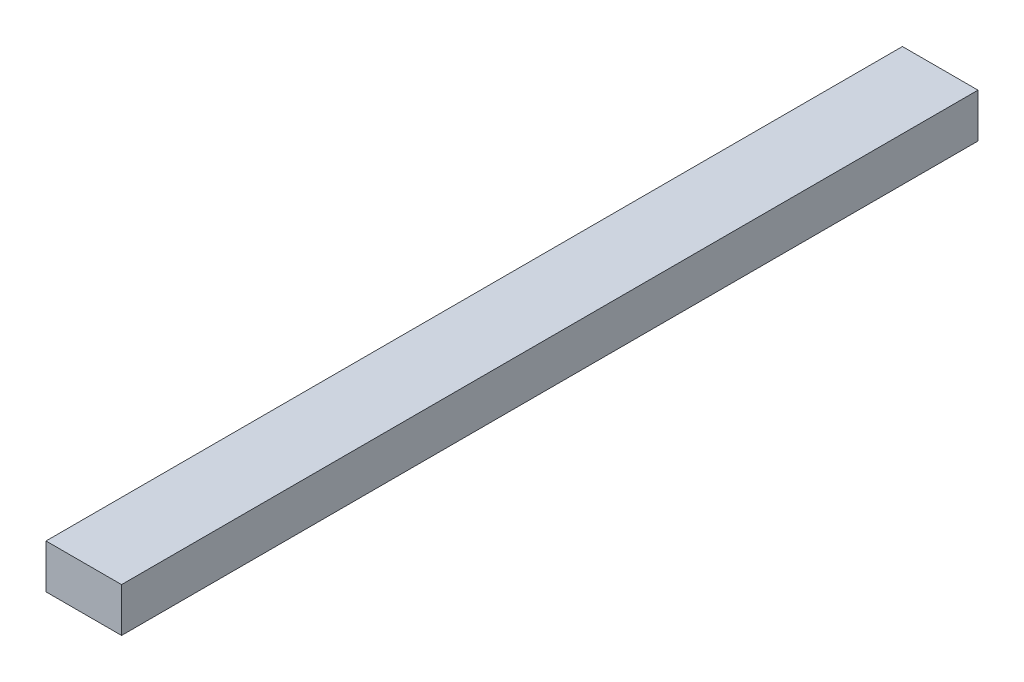
ISO-10303-21;
HEADER;
FILE_DESCRIPTION(('STEP AP214'),'2;1');
FILE_NAME('part.step','',(''),(''),'','','');
FILE_SCHEMA(('AUTOMOTIVE_DESIGN { 1 0 10303 214 1 1 1 1 }'));
ENDSEC;
DATA;
#1=APPLICATION_CONTEXT('core data for automotive mechanical design processes');
#2=APPLICATION_PROTOCOL_DEFINITION('international standard','automotive_design',2000,#1);
#3=PRODUCT_CONTEXT('',#1,'mechanical');
#4=PRODUCT('Part','Part','',(#3));
#5=PRODUCT_RELATED_PRODUCT_CATEGORY('part','',(#4));
#6=PRODUCT_DEFINITION_FORMATION('','',#4);
#7=PRODUCT_DEFINITION_CONTEXT('part definition',#1,'design');
#8=PRODUCT_DEFINITION('design','',#6,#7);
#9=PRODUCT_DEFINITION_SHAPE('','',#8);
#10=(LENGTH_UNIT() NAMED_UNIT(*) SI_UNIT(.MILLI.,.METRE.));
#11=(NAMED_UNIT(*) PLANE_ANGLE_UNIT() SI_UNIT($,.RADIAN.));
#12=(NAMED_UNIT(*) SI_UNIT($,.STERADIAN.) SOLID_ANGLE_UNIT());
#13=UNCERTAINTY_MEASURE_WITH_UNIT(LENGTH_MEASURE(1.E-05),#10,'distance_accuracy_value','');
#14=(GEOMETRIC_REPRESENTATION_CONTEXT(3) GLOBAL_UNCERTAINTY_ASSIGNED_CONTEXT((#13)) GLOBAL_UNIT_ASSIGNED_CONTEXT((#10,
#11,#12)) REPRESENTATION_CONTEXT('',''));
#15=CARTESIAN_POINT('',(0.,0.,0.));
#16=DIRECTION('',(0.,0.,1.));
#17=DIRECTION('',(1.,0.,0.));
#18=AXIS2_PLACEMENT_3D('',#15,#16,#17);
#19=CARTESIAN_POINT('',(0.,0.,431.8));
#20=DIRECTION('',(1.,0.,0.));
#21=DIRECTION('',(0.,0.,-1.));
#22=AXIS2_PLACEMENT_3D('',#19,#20,#21);
#23=PLANE('',#22);
#24=DIRECTION('',(0.,-1.,0.));
#25=VECTOR('',#24,1.);
#26=CARTESIAN_POINT('',(0.,0.,0.));
#27=LINE('',#26,#25);
#28=CARTESIAN_POINT('',(0.,22.225,0.));
#29=VERTEX_POINT('',#28);
#30=CARTESIAN_POINT('',(0.,0.,0.));
#31=VERTEX_POINT('',#30);
#32=EDGE_CURVE('E95',#29,#31,#27,.T.);
#33=ORIENTED_EDGE('',*,*,#32,.T.);
#34=DIRECTION('',(0.,0.,-1.));
#35=VECTOR('',#34,1.);
#36=CARTESIAN_POINT('',(0.,0.,431.8));
#37=LINE('',#36,#35);
#38=CARTESIAN_POINT('',(0.,0.,431.8));
#39=VERTEX_POINT('',#38);
#40=EDGE_CURVE('E11',#39,#31,#37,.T.);
#41=ORIENTED_EDGE('',*,*,#40,.F.);
#42=DIRECTION('',(0.,-1.,0.));
#43=VECTOR('',#42,1.);
#44=CARTESIAN_POINT('',(0.,0.,431.8));
#45=LINE('',#44,#43);
#46=CARTESIAN_POINT('',(0.,22.225,431.8));
#47=VERTEX_POINT('',#46);
#48=EDGE_CURVE('E83',#47,#39,#45,.T.);
#49=ORIENTED_EDGE('',*,*,#48,.F.);
#50=DIRECTION('',(0.,0.,-1.));
#51=VECTOR('',#50,1.);
#52=CARTESIAN_POINT('',(0.,22.225,431.8));
#53=LINE('',#52,#51);
#54=EDGE_CURVE('E91',#47,#29,#53,.T.);
#55=ORIENTED_EDGE('',*,*,#54,.T.);
#56=EDGE_LOOP('',(#33,#41,#49,#55));
#57=FACE_BOUND('',#56,.T.);
#58=ADVANCED_FACE('F32',(#57),#23,.F.);
#59=CARTESIAN_POINT('',(0.,0.,431.8));
#60=DIRECTION('',(0.,1.,0.));
#61=DIRECTION('',(0.,0.,1.));
#62=AXIS2_PLACEMENT_3D('',#59,#60,#61);
#63=PLANE('',#62);
#64=DIRECTION('',(1.,0.,0.));
#65=VECTOR('',#64,1.);
#66=CARTESIAN_POINT('',(0.,0.,0.));
#67=LINE('',#66,#65);
#68=CARTESIAN_POINT('',(38.1,0.,0.));
#69=VERTEX_POINT('',#68);
#70=EDGE_CURVE('E87',#31,#69,#67,.T.);
#71=ORIENTED_EDGE('',*,*,#70,.T.);
#72=DIRECTION('',(0.,0.,-1.));
#73=VECTOR('',#72,1.);
#74=CARTESIAN_POINT('',(38.1,0.,431.8));
#75=LINE('',#74,#73);
#76=CARTESIAN_POINT('',(38.1,0.,431.8));
#77=VERTEX_POINT('',#76);
#78=EDGE_CURVE('E40',#77,#69,#75,.T.);
#79=ORIENTED_EDGE('',*,*,#78,.F.);
#80=DIRECTION('',(1.,0.,0.));
#81=VECTOR('',#80,1.);
#82=CARTESIAN_POINT('',(0.,0.,431.8));
#83=LINE('',#82,#81);
#84=EDGE_CURVE('E78',#39,#77,#83,.T.);
#85=ORIENTED_EDGE('',*,*,#84,.F.);
#86=ORIENTED_EDGE('',*,*,#40,.T.);
#87=EDGE_LOOP('',(#71,#79,#85,#86));
#88=FACE_BOUND('',#87,.T.);
#89=ADVANCED_FACE('F86',(#88),#63,.F.);
#90=CARTESIAN_POINT('',(38.1,0.,431.8));
#91=DIRECTION('',(-1.,0.,0.));
#92=DIRECTION('',(0.,0.,1.));
#93=AXIS2_PLACEMENT_3D('',#90,#91,#92);
#94=PLANE('',#93);
#95=DIRECTION('',(0.,1.,0.));
#96=VECTOR('',#95,1.);
#97=CARTESIAN_POINT('',(38.1,0.,0.));
#98=LINE('',#97,#96);
#99=CARTESIAN_POINT('',(38.1,22.225,0.));
#100=VERTEX_POINT('',#99);
#101=EDGE_CURVE('E65',#69,#100,#98,.T.);
#102=ORIENTED_EDGE('',*,*,#101,.T.);
#103=DIRECTION('',(0.,0.,-1.));
#104=VECTOR('',#103,1.);
#105=CARTESIAN_POINT('',(38.1,22.225,431.8));
#106=LINE('',#105,#104);
#107=CARTESIAN_POINT('',(38.1,22.225,431.8));
#108=VERTEX_POINT('',#107);
#109=EDGE_CURVE('E88',#108,#100,#106,.T.);
#110=ORIENTED_EDGE('',*,*,#109,.F.);
#111=DIRECTION('',(0.,1.,0.));
#112=VECTOR('',#111,1.);
#113=CARTESIAN_POINT('',(38.1,0.,431.8));
#114=LINE('',#113,#112);
#115=EDGE_CURVE('E81',#77,#108,#114,.T.);
#116=ORIENTED_EDGE('',*,*,#115,.F.);
#117=ORIENTED_EDGE('',*,*,#78,.T.);
#118=EDGE_LOOP('',(#102,#110,#116,#117));
#119=FACE_BOUND('',#118,.T.);
#120=ADVANCED_FACE('F89',(#119),#94,.F.);
#121=CARTESIAN_POINT('',(0.,22.225,431.8));
#122=DIRECTION('',(0.,-1.,0.));
#123=DIRECTION('',(0.,0.,-1.));
#124=AXIS2_PLACEMENT_3D('',#121,#122,#123);
#125=PLANE('',#124);
#126=DIRECTION('',(-1.,0.,0.));
#127=VECTOR('',#126,1.);
#128=CARTESIAN_POINT('',(0.,22.225,0.));
#129=LINE('',#128,#127);
#130=EDGE_CURVE('E71',#100,#29,#129,.T.);
#131=ORIENTED_EDGE('',*,*,#130,.T.);
#132=ORIENTED_EDGE('',*,*,#54,.F.);
#133=DIRECTION('',(-1.,0.,0.));
#134=VECTOR('',#133,1.);
#135=CARTESIAN_POINT('',(0.,22.225,431.8));
#136=LINE('',#135,#134);
#137=EDGE_CURVE('E48',#108,#47,#136,.T.);
#138=ORIENTED_EDGE('',*,*,#137,.F.);
#139=ORIENTED_EDGE('',*,*,#109,.T.);
#140=EDGE_LOOP('',(#131,#132,#138,#139));
#141=FACE_BOUND('',#140,.T.);
#142=ADVANCED_FACE('F102',(#141),#125,.F.);
#143=CARTESIAN_POINT('',(0.,0.,431.8));
#144=DIRECTION('',(0.,0.,-1.));
#145=DIRECTION('',(-1.,0.,0.));
#146=AXIS2_PLACEMENT_3D('',#143,#144,#145);
#147=PLANE('',#146);
#148=ORIENTED_EDGE('',*,*,#48,.T.);
#149=ORIENTED_EDGE('',*,*,#84,.T.);
#150=ORIENTED_EDGE('',*,*,#115,.T.);
#151=ORIENTED_EDGE('',*,*,#137,.T.);
#152=EDGE_LOOP('',(#148,#149,#150,#151));
#153=FACE_BOUND('',#152,.T.);
#154=ADVANCED_FACE('F79',(#153),#147,.F.);
#155=CARTESIAN_POINT('',(0.,0.,0.));
#156=DIRECTION('',(0.,0.,-1.));
#157=DIRECTION('',(-1.,0.,0.));
#158=AXIS2_PLACEMENT_3D('',#155,#156,#157);
#159=PLANE('',#158);
#160=ORIENTED_EDGE('',*,*,#32,.F.);
#161=ORIENTED_EDGE('',*,*,#130,.F.);
#162=ORIENTED_EDGE('',*,*,#101,.F.);
#163=ORIENTED_EDGE('',*,*,#70,.F.);
#164=EDGE_LOOP('',(#160,#161,#162,#163));
#165=FACE_BOUND('',#164,.T.);
#166=ADVANCED_FACE('F105',(#165),#159,.T.);
#167=CLOSED_SHELL('',(#58,#89,#120,#142,#154,#166));
#168=MANIFOLD_SOLID_BREP('B2',#167);
#169=ADVANCED_BREP_SHAPE_REPRESENTATION('',(#18,#168),#14);
#170=SHAPE_DEFINITION_REPRESENTATION(#9,#169);
ENDSEC;
END-ISO-10303-21;
